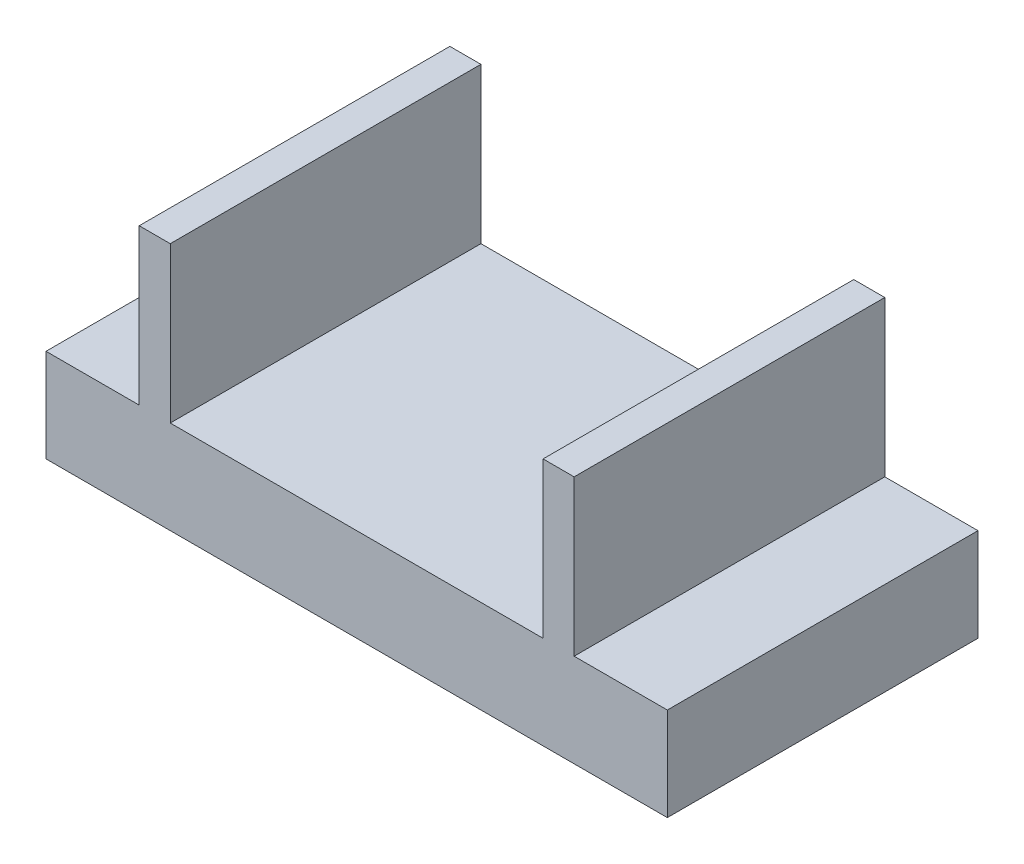
ISO-10303-21;
HEADER;
FILE_DESCRIPTION(('STEP AP214'),'2;1');
FILE_NAME('part.step','',(''),(''),'','','');
FILE_SCHEMA(('AUTOMOTIVE_DESIGN { 1 0 10303 214 1 1 1 1 }'));
ENDSEC;
DATA;
#1=APPLICATION_CONTEXT('core data for automotive mechanical design processes');
#2=APPLICATION_PROTOCOL_DEFINITION('international standard','automotive_design',2000,#1);
#3=PRODUCT_CONTEXT('',#1,'mechanical');
#4=PRODUCT('Part','Part','',(#3));
#5=PRODUCT_RELATED_PRODUCT_CATEGORY('part','',(#4));
#6=PRODUCT_DEFINITION_FORMATION('','',#4);
#7=PRODUCT_DEFINITION_CONTEXT('part definition',#1,'design');
#8=PRODUCT_DEFINITION('design','',#6,#7);
#9=PRODUCT_DEFINITION_SHAPE('','',#8);
#10=(LENGTH_UNIT() NAMED_UNIT(*) SI_UNIT(.MILLI.,.METRE.));
#11=(NAMED_UNIT(*) PLANE_ANGLE_UNIT() SI_UNIT($,.RADIAN.));
#12=(NAMED_UNIT(*) SI_UNIT($,.STERADIAN.) SOLID_ANGLE_UNIT());
#13=UNCERTAINTY_MEASURE_WITH_UNIT(LENGTH_MEASURE(1.E-05),#10,'distance_accuracy_value','');
#14=(GEOMETRIC_REPRESENTATION_CONTEXT(3) GLOBAL_UNCERTAINTY_ASSIGNED_CONTEXT((#13)) GLOBAL_UNIT_ASSIGNED_CONTEXT((#10,
#11,#12)) REPRESENTATION_CONTEXT('',''));
#15=CARTESIAN_POINT('',(0.,0.,0.));
#16=DIRECTION('',(0.,0.,1.));
#17=DIRECTION('',(1.,0.,0.));
#18=AXIS2_PLACEMENT_3D('',#15,#16,#17);
#19=CARTESIAN_POINT('',(0.,0.,10.));
#20=DIRECTION('',(-1.,0.,0.));
#21=DIRECTION('',(0.,0.,1.));
#22=AXIS2_PLACEMENT_3D('',#19,#20,#21);
#23=PLANE('',#22);
#24=DIRECTION('',(0.,1.,0.));
#25=VECTOR('',#24,1.);
#26=CARTESIAN_POINT('',(0.,0.,0.));
#27=LINE('',#26,#25);
#28=CARTESIAN_POINT('',(0.,0.,0.));
#29=VERTEX_POINT('',#28);
#30=CARTESIAN_POINT('',(0.,3.,0.));
#31=VERTEX_POINT('',#30);
#32=EDGE_CURVE('E167',#29,#31,#27,.T.);
#33=ORIENTED_EDGE('',*,*,#32,.F.);
#34=DIRECTION('',(0.,0.,-1.));
#35=VECTOR('',#34,1.);
#36=CARTESIAN_POINT('',(0.,0.,10.));
#37=LINE('',#36,#35);
#38=CARTESIAN_POINT('',(0.,0.,10.));
#39=VERTEX_POINT('',#38);
#40=EDGE_CURVE('E11',#39,#29,#37,.T.);
#41=ORIENTED_EDGE('',*,*,#40,.F.);
#42=DIRECTION('',(0.,1.,0.));
#43=VECTOR('',#42,1.);
#44=CARTESIAN_POINT('',(0.,0.,10.));
#45=LINE('',#44,#43);
#46=CARTESIAN_POINT('',(0.,3.,10.));
#47=VERTEX_POINT('',#46);
#48=EDGE_CURVE('E194',#39,#47,#45,.T.);
#49=ORIENTED_EDGE('',*,*,#48,.T.);
#50=DIRECTION('',(0.,0.,-1.));
#51=VECTOR('',#50,1.);
#52=CARTESIAN_POINT('',(0.,3.,10.));
#53=LINE('',#52,#51);
#54=EDGE_CURVE('E48',#47,#31,#53,.T.);
#55=ORIENTED_EDGE('',*,*,#54,.T.);
#56=EDGE_LOOP('',(#33,#41,#49,#55));
#57=FACE_BOUND('',#56,.T.);
#58=ADVANCED_FACE('F45',(#57),#23,.T.);
#59=CARTESIAN_POINT('',(0.,0.,10.));
#60=DIRECTION('',(0.,1.,0.));
#61=DIRECTION('',(0.,0.,1.));
#62=AXIS2_PLACEMENT_3D('',#59,#60,#61);
#63=PLANE('',#62);
#64=DIRECTION('',(1.,0.,0.));
#65=VECTOR('',#64,1.);
#66=CARTESIAN_POINT('',(0.,0.,0.));
#67=LINE('',#66,#65);
#68=CARTESIAN_POINT('',(20.,0.,0.));
#69=VERTEX_POINT('',#68);
#70=EDGE_CURVE('E102',#29,#69,#67,.T.);
#71=ORIENTED_EDGE('',*,*,#70,.T.);
#72=DIRECTION('',(0.,0.,-1.));
#73=VECTOR('',#72,1.);
#74=CARTESIAN_POINT('',(20.,0.,10.));
#75=LINE('',#74,#73);
#76=CARTESIAN_POINT('',(20.,0.,10.));
#77=VERTEX_POINT('',#76);
#78=EDGE_CURVE('E54',#77,#69,#75,.T.);
#79=ORIENTED_EDGE('',*,*,#78,.F.);
#80=DIRECTION('',(1.,0.,0.));
#81=VECTOR('',#80,1.);
#82=CARTESIAN_POINT('',(0.,0.,10.));
#83=LINE('',#82,#81);
#84=EDGE_CURVE('E145',#39,#77,#83,.T.);
#85=ORIENTED_EDGE('',*,*,#84,.F.);
#86=ORIENTED_EDGE('',*,*,#40,.T.);
#87=EDGE_LOOP('',(#71,#79,#85,#86));
#88=FACE_BOUND('',#87,.T.);
#89=ADVANCED_FACE('F272',(#88),#63,.F.);
#90=CARTESIAN_POINT('',(20.,0.,10.));
#91=DIRECTION('',(-1.,0.,0.));
#92=DIRECTION('',(0.,0.,1.));
#93=AXIS2_PLACEMENT_3D('',#90,#91,#92);
#94=PLANE('',#93);
#95=DIRECTION('',(0.,1.,0.));
#96=VECTOR('',#95,1.);
#97=CARTESIAN_POINT('',(20.,0.,0.));
#98=LINE('',#97,#96);
#99=CARTESIAN_POINT('',(20.,3.,0.));
#100=VERTEX_POINT('',#99);
#101=EDGE_CURVE('E152',#69,#100,#98,.T.);
#102=ORIENTED_EDGE('',*,*,#101,.T.);
#103=DIRECTION('',(0.,0.,-1.));
#104=VECTOR('',#103,1.);
#105=CARTESIAN_POINT('',(20.,3.,10.));
#106=LINE('',#105,#104);
#107=CARTESIAN_POINT('',(20.,3.,10.));
#108=VERTEX_POINT('',#107);
#109=EDGE_CURVE('E149',#108,#100,#106,.T.);
#110=ORIENTED_EDGE('',*,*,#109,.F.);
#111=DIRECTION('',(0.,1.,0.));
#112=VECTOR('',#111,1.);
#113=CARTESIAN_POINT('',(20.,0.,10.));
#114=LINE('',#113,#112);
#115=EDGE_CURVE('E138',#77,#108,#114,.T.);
#116=ORIENTED_EDGE('',*,*,#115,.F.);
#117=ORIENTED_EDGE('',*,*,#78,.T.);
#118=EDGE_LOOP('',(#102,#110,#116,#117));
#119=FACE_BOUND('',#118,.T.);
#120=ADVANCED_FACE('F150',(#119),#94,.F.);
#121=CARTESIAN_POINT('',(20.,3.,10.));
#122=DIRECTION('',(0.,-1.,0.));
#123=DIRECTION('',(1.,0.,0.));
#124=AXIS2_PLACEMENT_3D('',#121,#122,#123);
#125=PLANE('',#124);
#126=DIRECTION('',(-1.,0.,0.));
#127=VECTOR('',#126,1.);
#128=CARTESIAN_POINT('',(20.,3.,0.));
#129=LINE('',#128,#127);
#130=CARTESIAN_POINT('',(17.,3.,0.));
#131=VERTEX_POINT('',#130);
#132=EDGE_CURVE('E191',#100,#131,#129,.T.);
#133=ORIENTED_EDGE('',*,*,#132,.T.);
#134=DIRECTION('',(0.,0.,-1.));
#135=VECTOR('',#134,1.);
#136=CARTESIAN_POINT('',(17.,3.,10.));
#137=LINE('',#136,#135);
#138=CARTESIAN_POINT('',(17.,3.,10.));
#139=VERTEX_POINT('',#138);
#140=EDGE_CURVE('E155',#139,#131,#137,.T.);
#141=ORIENTED_EDGE('',*,*,#140,.F.);
#142=DIRECTION('',(-1.,0.,0.));
#143=VECTOR('',#142,1.);
#144=CARTESIAN_POINT('',(20.,3.,10.));
#145=LINE('',#144,#143);
#146=EDGE_CURVE('E143',#108,#139,#145,.T.);
#147=ORIENTED_EDGE('',*,*,#146,.F.);
#148=ORIENTED_EDGE('',*,*,#109,.T.);
#149=EDGE_LOOP('',(#133,#141,#147,#148));
#150=FACE_BOUND('',#149,.T.);
#151=ADVANCED_FACE('F157',(#150),#125,.F.);
#152=CARTESIAN_POINT('',(17.,3.,10.));
#153=DIRECTION('',(-1.,0.,0.));
#154=DIRECTION('',(0.,0.,1.));
#155=AXIS2_PLACEMENT_3D('',#152,#153,#154);
#156=PLANE('',#155);
#157=DIRECTION('',(0.,1.,0.));
#158=VECTOR('',#157,1.);
#159=CARTESIAN_POINT('',(17.,3.,0.));
#160=LINE('',#159,#158);
#161=CARTESIAN_POINT('',(17.,8.,0.));
#162=VERTEX_POINT('',#161);
#163=EDGE_CURVE('E189',#131,#162,#160,.T.);
#164=ORIENTED_EDGE('',*,*,#163,.T.);
#165=DIRECTION('',(0.,0.,-1.));
#166=VECTOR('',#165,1.);
#167=CARTESIAN_POINT('',(17.,8.,10.));
#168=LINE('',#167,#166);
#169=CARTESIAN_POINT('',(17.,8.,10.));
#170=VERTEX_POINT('',#169);
#171=EDGE_CURVE('E198',#170,#162,#168,.T.);
#172=ORIENTED_EDGE('',*,*,#171,.F.);
#173=DIRECTION('',(0.,1.,0.));
#174=VECTOR('',#173,1.);
#175=CARTESIAN_POINT('',(17.,3.,10.));
#176=LINE('',#175,#174);
#177=EDGE_CURVE('E160',#139,#170,#176,.T.);
#178=ORIENTED_EDGE('',*,*,#177,.F.);
#179=ORIENTED_EDGE('',*,*,#140,.T.);
#180=EDGE_LOOP('',(#164,#172,#178,#179));
#181=FACE_BOUND('',#180,.T.);
#182=ADVANCED_FACE('F220',(#181),#156,.F.);
#183=CARTESIAN_POINT('',(17.,8.,10.));
#184=DIRECTION('',(0.,-1.,0.));
#185=DIRECTION('',(0.,0.,-1.));
#186=AXIS2_PLACEMENT_3D('',#183,#184,#185);
#187=PLANE('',#186);
#188=DIRECTION('',(-1.,0.,0.));
#189=VECTOR('',#188,1.);
#190=CARTESIAN_POINT('',(17.,8.,0.));
#191=LINE('',#190,#189);
#192=CARTESIAN_POINT('',(16.,8.,0.));
#193=VERTEX_POINT('',#192);
#194=EDGE_CURVE('E187',#162,#193,#191,.T.);
#195=ORIENTED_EDGE('',*,*,#194,.T.);
#196=DIRECTION('',(0.,0.,-1.));
#197=VECTOR('',#196,1.);
#198=CARTESIAN_POINT('',(16.,8.,10.));
#199=LINE('',#198,#197);
#200=CARTESIAN_POINT('',(16.,8.,10.));
#201=VERTEX_POINT('',#200);
#202=EDGE_CURVE('E201',#201,#193,#199,.T.);
#203=ORIENTED_EDGE('',*,*,#202,.F.);
#204=DIRECTION('',(-1.,0.,0.));
#205=VECTOR('',#204,1.);
#206=CARTESIAN_POINT('',(17.,8.,10.));
#207=LINE('',#206,#205);
#208=EDGE_CURVE('E162',#170,#201,#207,.T.);
#209=ORIENTED_EDGE('',*,*,#208,.F.);
#210=ORIENTED_EDGE('',*,*,#171,.T.);
#211=EDGE_LOOP('',(#195,#203,#209,#210));
#212=FACE_BOUND('',#211,.T.);
#213=ADVANCED_FACE('F228',(#212),#187,.F.);
#214=CARTESIAN_POINT('',(16.,8.,10.));
#215=DIRECTION('',(1.,0.,0.));
#216=DIRECTION('',(0.,0.,-1.));
#217=AXIS2_PLACEMENT_3D('',#214,#215,#216);
#218=PLANE('',#217);
#219=DIRECTION('',(0.,-1.,0.));
#220=VECTOR('',#219,1.);
#221=CARTESIAN_POINT('',(16.,8.,0.));
#222=LINE('',#221,#220);
#223=CARTESIAN_POINT('',(16.,3.,0.));
#224=VERTEX_POINT('',#223);
#225=EDGE_CURVE('E185',#193,#224,#222,.T.);
#226=ORIENTED_EDGE('',*,*,#225,.T.);
#227=DIRECTION('',(0.,0.,-1.));
#228=VECTOR('',#227,1.);
#229=CARTESIAN_POINT('',(16.,3.,10.));
#230=LINE('',#229,#228);
#231=CARTESIAN_POINT('',(16.,3.,10.));
#232=VERTEX_POINT('',#231);
#233=EDGE_CURVE('E204',#232,#224,#230,.T.);
#234=ORIENTED_EDGE('',*,*,#233,.F.);
#235=DIRECTION('',(0.,-1.,0.));
#236=VECTOR('',#235,1.);
#237=CARTESIAN_POINT('',(16.,8.,10.));
#238=LINE('',#237,#236);
#239=EDGE_CURVE('E225',#201,#232,#238,.T.);
#240=ORIENTED_EDGE('',*,*,#239,.F.);
#241=ORIENTED_EDGE('',*,*,#202,.T.);
#242=EDGE_LOOP('',(#226,#234,#240,#241));
#243=FACE_BOUND('',#242,.T.);
#244=ADVANCED_FACE('F231',(#243),#218,.F.);
#245=CARTESIAN_POINT('',(16.,3.,10.));
#246=DIRECTION('',(0.,-1.,0.));
#247=DIRECTION('',(1.,0.,0.));
#248=AXIS2_PLACEMENT_3D('',#245,#246,#247);
#249=PLANE('',#248);
#250=DIRECTION('',(-1.,0.,0.));
#251=VECTOR('',#250,1.);
#252=CARTESIAN_POINT('',(16.,3.,0.));
#253=LINE('',#252,#251);
#254=CARTESIAN_POINT('',(4.,3.,0.));
#255=VERTEX_POINT('',#254);
#256=EDGE_CURVE('E182',#224,#255,#253,.T.);
#257=ORIENTED_EDGE('',*,*,#256,.T.);
#258=DIRECTION('',(0.,0.,-1.));
#259=VECTOR('',#258,1.);
#260=CARTESIAN_POINT('',(4.,3.,10.));
#261=LINE('',#260,#259);
#262=CARTESIAN_POINT('',(4.,3.,10.));
#263=VERTEX_POINT('',#262);
#264=EDGE_CURVE('E207',#263,#255,#261,.T.);
#265=ORIENTED_EDGE('',*,*,#264,.F.);
#266=DIRECTION('',(-1.,0.,0.));
#267=VECTOR('',#266,1.);
#268=CARTESIAN_POINT('',(16.,3.,10.));
#269=LINE('',#268,#267);
#270=EDGE_CURVE('E233',#232,#263,#269,.T.);
#271=ORIENTED_EDGE('',*,*,#270,.F.);
#272=ORIENTED_EDGE('',*,*,#233,.T.);
#273=EDGE_LOOP('',(#257,#265,#271,#272));
#274=FACE_BOUND('',#273,.T.);
#275=ADVANCED_FACE('F261',(#274),#249,.F.);
#276=CARTESIAN_POINT('',(4.,8.,10.));
#277=DIRECTION('',(1.,0.,0.));
#278=DIRECTION('',(0.,0.,-1.));
#279=AXIS2_PLACEMENT_3D('',#276,#277,#278);
#280=PLANE('',#279);
#281=DIRECTION('',(0.,-1.,0.));
#282=VECTOR('',#281,1.);
#283=CARTESIAN_POINT('',(4.,8.,0.));
#284=LINE('',#283,#282);
#285=CARTESIAN_POINT('',(4.,8.,0.));
#286=VERTEX_POINT('',#285);
#287=EDGE_CURVE('E179',#286,#255,#284,.T.);
#288=ORIENTED_EDGE('',*,*,#287,.F.);
#289=DIRECTION('',(0.,0.,-1.));
#290=VECTOR('',#289,1.);
#291=CARTESIAN_POINT('',(4.,8.,10.));
#292=LINE('',#291,#290);
#293=CARTESIAN_POINT('',(4.,8.,10.));
#294=VERTEX_POINT('',#293);
#295=EDGE_CURVE('E209',#294,#286,#292,.T.);
#296=ORIENTED_EDGE('',*,*,#295,.F.);
#297=DIRECTION('',(0.,-1.,0.));
#298=VECTOR('',#297,1.);
#299=CARTESIAN_POINT('',(4.,8.,10.));
#300=LINE('',#299,#298);
#301=EDGE_CURVE('E235',#294,#263,#300,.T.);
#302=ORIENTED_EDGE('',*,*,#301,.T.);
#303=ORIENTED_EDGE('',*,*,#264,.T.);
#304=EDGE_LOOP('',(#288,#296,#302,#303));
#305=FACE_BOUND('',#304,.T.);
#306=ADVANCED_FACE('F258',(#305),#280,.T.);
#307=CARTESIAN_POINT('',(4.,8.,10.));
#308=DIRECTION('',(0.,-1.,0.));
#309=DIRECTION('',(0.,0.,-1.));
#310=AXIS2_PLACEMENT_3D('',#307,#308,#309);
#311=PLANE('',#310);
#312=DIRECTION('',(-1.,0.,0.));
#313=VECTOR('',#312,1.);
#314=CARTESIAN_POINT('',(4.,8.,0.));
#315=LINE('',#314,#313);
#316=CARTESIAN_POINT('',(3.,8.,0.));
#317=VERTEX_POINT('',#316);
#318=EDGE_CURVE('E176',#286,#317,#315,.T.);
#319=ORIENTED_EDGE('',*,*,#318,.T.);
#320=DIRECTION('',(0.,0.,-1.));
#321=VECTOR('',#320,1.);
#322=CARTESIAN_POINT('',(3.,8.,10.));
#323=LINE('',#322,#321);
#324=CARTESIAN_POINT('',(3.,8.,10.));
#325=VERTEX_POINT('',#324);
#326=EDGE_CURVE('E211',#325,#317,#323,.T.);
#327=ORIENTED_EDGE('',*,*,#326,.F.);
#328=DIRECTION('',(-1.,0.,0.));
#329=VECTOR('',#328,1.);
#330=CARTESIAN_POINT('',(4.,8.,10.));
#331=LINE('',#330,#329);
#332=EDGE_CURVE('E240',#294,#325,#331,.T.);
#333=ORIENTED_EDGE('',*,*,#332,.F.);
#334=ORIENTED_EDGE('',*,*,#295,.T.);
#335=EDGE_LOOP('',(#319,#327,#333,#334));
#336=FACE_BOUND('',#335,.T.);
#337=ADVANCED_FACE('F268',(#336),#311,.F.);
#338=CARTESIAN_POINT('',(3.,3.,10.));
#339=DIRECTION('',(-1.,0.,0.));
#340=DIRECTION('',(0.,0.,1.));
#341=AXIS2_PLACEMENT_3D('',#338,#339,#340);
#342=PLANE('',#341);
#343=DIRECTION('',(0.,1.,0.));
#344=VECTOR('',#343,1.);
#345=CARTESIAN_POINT('',(3.,3.,0.));
#346=LINE('',#345,#344);
#347=CARTESIAN_POINT('',(3.,3.,0.));
#348=VERTEX_POINT('',#347);
#349=EDGE_CURVE('E173',#348,#317,#346,.T.);
#350=ORIENTED_EDGE('',*,*,#349,.F.);
#351=DIRECTION('',(0.,0.,-1.));
#352=VECTOR('',#351,1.);
#353=CARTESIAN_POINT('',(3.,3.,10.));
#354=LINE('',#353,#352);
#355=CARTESIAN_POINT('',(3.,3.,10.));
#356=VERTEX_POINT('',#355);
#357=EDGE_CURVE('E212',#356,#348,#354,.T.);
#358=ORIENTED_EDGE('',*,*,#357,.F.);
#359=DIRECTION('',(0.,1.,0.));
#360=VECTOR('',#359,1.);
#361=CARTESIAN_POINT('',(3.,3.,10.));
#362=LINE('',#361,#360);
#363=EDGE_CURVE('E242',#356,#325,#362,.T.);
#364=ORIENTED_EDGE('',*,*,#363,.T.);
#365=ORIENTED_EDGE('',*,*,#326,.T.);
#366=EDGE_LOOP('',(#350,#358,#364,#365));
#367=FACE_BOUND('',#366,.T.);
#368=ADVANCED_FACE('F252',(#367),#342,.T.);
#369=CARTESIAN_POINT('',(0.,3.,10.));
#370=DIRECTION('',(0.,1.,0.));
#371=DIRECTION('',(0.,0.,1.));
#372=AXIS2_PLACEMENT_3D('',#369,#370,#371);
#373=PLANE('',#372);
#374=DIRECTION('',(1.,0.,0.));
#375=VECTOR('',#374,1.);
#376=CARTESIAN_POINT('',(0.,3.,0.));
#377=LINE('',#376,#375);
#378=EDGE_CURVE('E170',#31,#348,#377,.T.);
#379=ORIENTED_EDGE('',*,*,#378,.F.);
#380=ORIENTED_EDGE('',*,*,#54,.F.);
#381=DIRECTION('',(1.,0.,0.));
#382=VECTOR('',#381,1.);
#383=CARTESIAN_POINT('',(0.,3.,10.));
#384=LINE('',#383,#382);
#385=EDGE_CURVE('E245',#47,#356,#384,.T.);
#386=ORIENTED_EDGE('',*,*,#385,.T.);
#387=ORIENTED_EDGE('',*,*,#357,.T.);
#388=EDGE_LOOP('',(#379,#380,#386,#387));
#389=FACE_BOUND('',#388,.T.);
#390=ADVANCED_FACE('F214',(#389),#373,.T.);
#391=CARTESIAN_POINT('',(0.,0.,10.));
#392=DIRECTION('',(0.,0.,-1.));
#393=DIRECTION('',(-1.,0.,0.));
#394=AXIS2_PLACEMENT_3D('',#391,#392,#393);
#395=PLANE('',#394);
#396=ORIENTED_EDGE('',*,*,#48,.F.);
#397=ORIENTED_EDGE('',*,*,#84,.T.);
#398=ORIENTED_EDGE('',*,*,#115,.T.);
#399=ORIENTED_EDGE('',*,*,#146,.T.);
#400=ORIENTED_EDGE('',*,*,#177,.T.);
#401=ORIENTED_EDGE('',*,*,#208,.T.);
#402=ORIENTED_EDGE('',*,*,#239,.T.);
#403=ORIENTED_EDGE('',*,*,#270,.T.);
#404=ORIENTED_EDGE('',*,*,#301,.F.);
#405=ORIENTED_EDGE('',*,*,#332,.T.);
#406=ORIENTED_EDGE('',*,*,#363,.F.);
#407=ORIENTED_EDGE('',*,*,#385,.F.);
#408=EDGE_LOOP('',(#396,#397,#398,#399,#400,#401,#402,#403,#404,#405,#406,#407));
#409=FACE_BOUND('',#408,.T.);
#410=ADVANCED_FACE('F141',(#409),#395,.F.);
#411=CARTESIAN_POINT('',(0.,0.,0.));
#412=DIRECTION('',(0.,0.,-1.));
#413=DIRECTION('',(-1.,0.,0.));
#414=AXIS2_PLACEMENT_3D('',#411,#412,#413);
#415=PLANE('',#414);
#416=ORIENTED_EDGE('',*,*,#32,.T.);
#417=ORIENTED_EDGE('',*,*,#378,.T.);
#418=ORIENTED_EDGE('',*,*,#349,.T.);
#419=ORIENTED_EDGE('',*,*,#318,.F.);
#420=ORIENTED_EDGE('',*,*,#287,.T.);
#421=ORIENTED_EDGE('',*,*,#256,.F.);
#422=ORIENTED_EDGE('',*,*,#225,.F.);
#423=ORIENTED_EDGE('',*,*,#194,.F.);
#424=ORIENTED_EDGE('',*,*,#163,.F.);
#425=ORIENTED_EDGE('',*,*,#132,.F.);
#426=ORIENTED_EDGE('',*,*,#101,.F.);
#427=ORIENTED_EDGE('',*,*,#70,.F.);
#428=EDGE_LOOP('',(#416,#417,#418,#419,#420,#421,#422,#423,#424,#425,#426,#427));
#429=FACE_BOUND('',#428,.T.);
#430=ADVANCED_FACE('F216',(#429),#415,.T.);
#431=CLOSED_SHELL('',(#58,#89,#120,#151,#182,#213,#244,#275,#306,#337,#368,#390,#410,#430));
#432=MANIFOLD_SOLID_BREP('B2',#431);
#433=ADVANCED_BREP_SHAPE_REPRESENTATION('',(#18,#432),#14);
#434=SHAPE_DEFINITION_REPRESENTATION(#9,#433);
ENDSEC;
END-ISO-10303-21;
